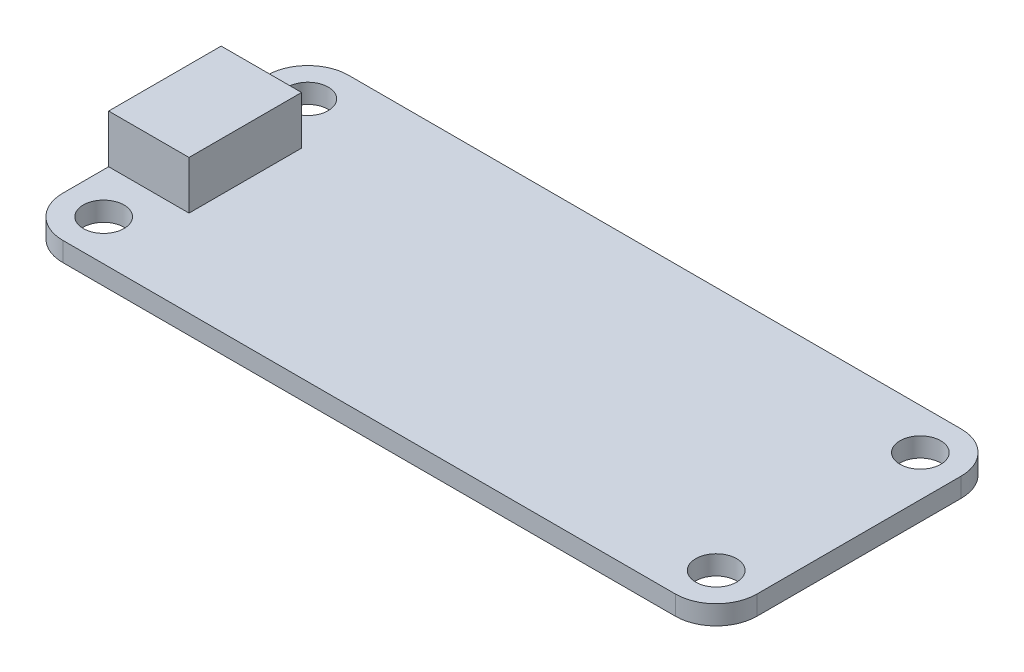
ISO-10303-21;
HEADER;
FILE_DESCRIPTION(('STEP AP214'),'2;1');
FILE_NAME('part.step','',(''),(''),'','','');
FILE_SCHEMA(('AUTOMOTIVE_DESIGN { 1 0 10303 214 1 1 1 1 }'));
ENDSEC;
DATA;
#1=APPLICATION_CONTEXT('core data for automotive mechanical design processes');
#2=APPLICATION_PROTOCOL_DEFINITION('international standard','automotive_design',2000,#1);
#3=PRODUCT_CONTEXT('',#1,'mechanical');
#4=PRODUCT('Part','Part','',(#3));
#5=PRODUCT_RELATED_PRODUCT_CATEGORY('part','',(#4));
#6=PRODUCT_DEFINITION_FORMATION('','',#4);
#7=PRODUCT_DEFINITION_CONTEXT('part definition',#1,'design');
#8=PRODUCT_DEFINITION('design','',#6,#7);
#9=PRODUCT_DEFINITION_SHAPE('','',#8);
#10=(LENGTH_UNIT() NAMED_UNIT(*) SI_UNIT(.MILLI.,.METRE.));
#11=(NAMED_UNIT(*) PLANE_ANGLE_UNIT() SI_UNIT($,.RADIAN.));
#12=(NAMED_UNIT(*) SI_UNIT($,.STERADIAN.) SOLID_ANGLE_UNIT());
#13=UNCERTAINTY_MEASURE_WITH_UNIT(LENGTH_MEASURE(1.E-05),#10,'distance_accuracy_value','');
#14=(GEOMETRIC_REPRESENTATION_CONTEXT(3) GLOBAL_UNCERTAINTY_ASSIGNED_CONTEXT((#13)) GLOBAL_UNIT_ASSIGNED_CONTEXT((#10,
#11,#12)) REPRESENTATION_CONTEXT('',''));
#15=CARTESIAN_POINT('',(0.,0.,0.));
#16=DIRECTION('',(0.,0.,1.));
#17=DIRECTION('',(1.,0.,0.));
#18=AXIS2_PLACEMENT_3D('',#15,#16,#17);
#19=CARTESIAN_POINT('',(0.,1.2,0.));
#20=DIRECTION('',(0.,1.,0.));
#21=DIRECTION('',(0.,0.,1.));
#22=AXIS2_PLACEMENT_3D('',#19,#20,#21);
#23=PLANE('',#22);
#24=DIRECTION('',(-1.,0.,0.));
#25=VECTOR('',#24,1.);
#26=CARTESIAN_POINT('',(-43.18,1.2,-12.39));
#27=LINE('',#26,#25);
#28=CARTESIAN_POINT('',(-38.18,1.2,-12.39));
#29=VERTEX_POINT('',#28);
#30=CARTESIAN_POINT('',(-43.18,1.2,-12.39));
#31=VERTEX_POINT('',#30);
#32=EDGE_CURVE('E57',#29,#31,#27,.T.);
#33=ORIENTED_EDGE('',*,*,#32,.F.);
#34=DIRECTION('',(0.,0.,-1.));
#35=VECTOR('',#34,1.);
#36=CARTESIAN_POINT('',(-38.18,1.2,-5.39));
#37=LINE('',#36,#35);
#38=CARTESIAN_POINT('',(-38.18,1.2,-5.39));
#39=VERTEX_POINT('',#38);
#40=EDGE_CURVE('E313',#39,#29,#37,.T.);
#41=ORIENTED_EDGE('',*,*,#40,.F.);
#42=DIRECTION('',(1.,0.,0.));
#43=VECTOR('',#42,1.);
#44=CARTESIAN_POINT('',(-43.18,1.2,-5.39));
#45=LINE('',#44,#43);
#46=CARTESIAN_POINT('',(-43.18,1.2,-5.39));
#47=VERTEX_POINT('',#46);
#48=EDGE_CURVE('E63',#47,#39,#45,.T.);
#49=ORIENTED_EDGE('',*,*,#48,.F.);
#50=DIRECTION('',(0.,0.,1.));
#51=VECTOR('',#50,1.);
#52=CARTESIAN_POINT('',(-43.18,1.2,0.));
#53=LINE('',#52,#51);
#54=CARTESIAN_POINT('',(-43.18,1.2,-2.54));
#55=VERTEX_POINT('',#54);
#56=EDGE_CURVE('E154',#47,#55,#53,.T.);
#57=ORIENTED_EDGE('',*,*,#56,.T.);
#58=CARTESIAN_POINT('',(-40.64,1.2,-2.54));
#59=DIRECTION('',(0.,1.,0.));
#60=DIRECTION('',(0.,0.,1.));
#61=AXIS2_PLACEMENT_3D('',#58,#59,#60);
#62=CIRCLE('',#61,2.54);
#63=CARTESIAN_POINT('',(-40.64,1.2,0.));
#64=VERTEX_POINT('',#63);
#65=EDGE_CURVE('E251',#55,#64,#62,.T.);
#66=ORIENTED_EDGE('',*,*,#65,.T.);
#67=DIRECTION('',(1.,0.,0.));
#68=VECTOR('',#67,1.);
#69=CARTESIAN_POINT('',(0.,1.2,0.));
#70=LINE('',#69,#68);
#71=CARTESIAN_POINT('',(-2.54,1.2,0.));
#72=VERTEX_POINT('',#71);
#73=EDGE_CURVE('E207',#64,#72,#70,.T.);
#74=ORIENTED_EDGE('',*,*,#73,.T.);
#75=CARTESIAN_POINT('',(-2.54,1.2,-2.54));
#76=DIRECTION('',(0.,1.,0.));
#77=DIRECTION('',(0.,0.,1.));
#78=AXIS2_PLACEMENT_3D('',#75,#76,#77);
#79=CIRCLE('',#78,2.54);
#80=CARTESIAN_POINT('',(0.,1.2,-2.54));
#81=VERTEX_POINT('',#80);
#82=EDGE_CURVE('E254',#72,#81,#79,.T.);
#83=ORIENTED_EDGE('',*,*,#82,.T.);
#84=DIRECTION('',(0.,0.,-1.));
#85=VECTOR('',#84,1.);
#86=CARTESIAN_POINT('',(0.,1.2,0.));
#87=LINE('',#86,#85);
#88=CARTESIAN_POINT('',(0.,1.2,-15.24));
#89=VERTEX_POINT('',#88);
#90=EDGE_CURVE('E195',#81,#89,#87,.T.);
#91=ORIENTED_EDGE('',*,*,#90,.T.);
#92=CARTESIAN_POINT('',(-2.54,1.2,-15.24));
#93=DIRECTION('',(0.,1.,0.));
#94=DIRECTION('',(0.,0.,1.));
#95=AXIS2_PLACEMENT_3D('',#92,#93,#94);
#96=CIRCLE('',#95,2.54);
#97=CARTESIAN_POINT('',(-2.54,1.2,-17.78));
#98=VERTEX_POINT('',#97);
#99=EDGE_CURVE('E257',#89,#98,#96,.T.);
#100=ORIENTED_EDGE('',*,*,#99,.T.);
#101=DIRECTION('',(-1.,0.,0.));
#102=VECTOR('',#101,1.);
#103=CARTESIAN_POINT('',(0.,1.2,-17.78));
#104=LINE('',#103,#102);
#105=CARTESIAN_POINT('',(-40.64,1.2,-17.78));
#106=VERTEX_POINT('',#105);
#107=EDGE_CURVE('E199',#98,#106,#104,.T.);
#108=ORIENTED_EDGE('',*,*,#107,.T.);
#109=CARTESIAN_POINT('',(-40.64,1.2,-15.24));
#110=DIRECTION('',(0.,1.,0.));
#111=DIRECTION('',(0.,0.,1.));
#112=AXIS2_PLACEMENT_3D('',#109,#110,#111);
#113=CIRCLE('',#112,2.54);
#114=CARTESIAN_POINT('',(-43.18,1.2,-15.24));
#115=VERTEX_POINT('',#114);
#116=EDGE_CURVE('E260',#106,#115,#113,.T.);
#117=ORIENTED_EDGE('',*,*,#116,.T.);
#118=EDGE_CURVE('E204',#115,#31,#53,.T.);
#119=ORIENTED_EDGE('',*,*,#118,.T.);
#120=EDGE_LOOP('',(#33,#41,#49,#57,#66,#74,#83,#91,#100,#108,#117,#119));
#121=FACE_BOUND('',#120,.T.);
#122=CARTESIAN_POINT('',(-2.54,1.2,-2.53999999999999));
#123=DIRECTION('',(0.,1.,0.));
#124=DIRECTION('',(0.,0.,1.));
#125=AXIS2_PLACEMENT_3D('',#122,#123,#124);
#126=CIRCLE('',#125,1.27);
#127=CARTESIAN_POINT('',(-2.54,1.2,-1.26999999999999));
#128=VERTEX_POINT('',#127);
#129=EDGE_CURVE('E171',#128,#128,#126,.T.);
#130=ORIENTED_EDGE('',*,*,#129,.F.);
#131=EDGE_LOOP('',(#130));
#132=FACE_BOUND('',#131,.T.);
#133=CARTESIAN_POINT('',(-40.64,1.2,-15.24));
#134=DIRECTION('',(0.,1.,0.));
#135=DIRECTION('',(0.,0.,1.));
#136=AXIS2_PLACEMENT_3D('',#133,#134,#135);
#137=CIRCLE('',#136,1.27);
#138=CARTESIAN_POINT('',(-40.64,1.2,-13.97));
#139=VERTEX_POINT('',#138);
#140=EDGE_CURVE('E187',#139,#139,#137,.T.);
#141=ORIENTED_EDGE('',*,*,#140,.F.);
#142=EDGE_LOOP('',(#141));
#143=FACE_BOUND('',#142,.T.);
#144=CARTESIAN_POINT('',(-40.64,1.2,-2.53999999999999));
#145=DIRECTION('',(0.,1.,0.));
#146=DIRECTION('',(0.,0.,1.));
#147=AXIS2_PLACEMENT_3D('',#144,#145,#146);
#148=CIRCLE('',#147,1.27);
#149=CARTESIAN_POINT('',(-40.64,1.2,-1.26999999999999));
#150=VERTEX_POINT('',#149);
#151=EDGE_CURVE('E179',#150,#150,#148,.T.);
#152=ORIENTED_EDGE('',*,*,#151,.F.);
#153=EDGE_LOOP('',(#152));
#154=FACE_BOUND('',#153,.T.);
#155=CARTESIAN_POINT('',(-2.54,1.2,-15.24));
#156=DIRECTION('',(0.,1.,0.));
#157=DIRECTION('',(0.,0.,1.));
#158=AXIS2_PLACEMENT_3D('',#155,#156,#157);
#159=CIRCLE('',#158,1.27);
#160=CARTESIAN_POINT('',(-2.54,1.2,-13.97));
#161=VERTEX_POINT('',#160);
#162=EDGE_CURVE('E161',#161,#161,#159,.T.);
#163=ORIENTED_EDGE('',*,*,#162,.F.);
#164=EDGE_LOOP('',(#163));
#165=FACE_BOUND('',#164,.T.);
#166=ADVANCED_FACE('F41',(#121,#132,#143,#154,#165),#23,.T.);
#167=CARTESIAN_POINT('',(0.,0.,0.));
#168=DIRECTION('',(0.,1.,0.));
#169=DIRECTION('',(0.,0.,1.));
#170=AXIS2_PLACEMENT_3D('',#167,#168,#169);
#171=PLANE('',#170);
#172=DIRECTION('',(0.,0.,1.));
#173=VECTOR('',#172,1.);
#174=CARTESIAN_POINT('',(-43.18,0.,0.));
#175=LINE('',#174,#173);
#176=CARTESIAN_POINT('',(-43.18,0.,-15.24));
#177=VERTEX_POINT('',#176);
#178=CARTESIAN_POINT('',(-43.18,0.,-2.54));
#179=VERTEX_POINT('',#178);
#180=EDGE_CURVE('E219',#177,#179,#175,.T.);
#181=ORIENTED_EDGE('',*,*,#180,.F.);
#182=CARTESIAN_POINT('',(-40.64,0.,-15.24));
#183=DIRECTION('',(0.,1.,0.));
#184=DIRECTION('',(0.,0.,1.));
#185=AXIS2_PLACEMENT_3D('',#182,#183,#184);
#186=CIRCLE('',#185,2.54);
#187=CARTESIAN_POINT('',(-40.64,0.,-17.78));
#188=VERTEX_POINT('',#187);
#189=EDGE_CURVE('E241',#177,#188,#186,.F.);
#190=ORIENTED_EDGE('',*,*,#189,.T.);
#191=DIRECTION('',(-1.,0.,0.));
#192=VECTOR('',#191,1.);
#193=CARTESIAN_POINT('',(0.,0.,-17.78));
#194=LINE('',#193,#192);
#195=CARTESIAN_POINT('',(-2.54,0.,-17.78));
#196=VERTEX_POINT('',#195);
#197=EDGE_CURVE('E215',#196,#188,#194,.T.);
#198=ORIENTED_EDGE('',*,*,#197,.F.);
#199=CARTESIAN_POINT('',(-2.54,0.,-15.24));
#200=DIRECTION('',(0.,1.,0.));
#201=DIRECTION('',(0.,0.,1.));
#202=AXIS2_PLACEMENT_3D('',#199,#200,#201);
#203=CIRCLE('',#202,2.54);
#204=CARTESIAN_POINT('',(0.,0.,-15.24));
#205=VERTEX_POINT('',#204);
#206=EDGE_CURVE('E238',#196,#205,#203,.F.);
#207=ORIENTED_EDGE('',*,*,#206,.T.);
#208=DIRECTION('',(0.,0.,-1.));
#209=VECTOR('',#208,1.);
#210=CARTESIAN_POINT('',(0.,0.,0.));
#211=LINE('',#210,#209);
#212=CARTESIAN_POINT('',(0.,0.,-2.54));
#213=VERTEX_POINT('',#212);
#214=EDGE_CURVE('E191',#213,#205,#211,.T.);
#215=ORIENTED_EDGE('',*,*,#214,.F.);
#216=CARTESIAN_POINT('',(-2.54,0.,-2.54));
#217=DIRECTION('',(0.,1.,0.));
#218=DIRECTION('',(0.,0.,1.));
#219=AXIS2_PLACEMENT_3D('',#216,#217,#218);
#220=CIRCLE('',#219,2.54);
#221=CARTESIAN_POINT('',(-2.54,0.,0.));
#222=VERTEX_POINT('',#221);
#223=EDGE_CURVE('E235',#213,#222,#220,.F.);
#224=ORIENTED_EDGE('',*,*,#223,.T.);
#225=DIRECTION('',(1.,0.,0.));
#226=VECTOR('',#225,1.);
#227=CARTESIAN_POINT('',(0.,0.,0.));
#228=LINE('',#227,#226);
#229=CARTESIAN_POINT('',(-40.64,0.,0.));
#230=VERTEX_POINT('',#229);
#231=EDGE_CURVE('E200',#230,#222,#228,.T.);
#232=ORIENTED_EDGE('',*,*,#231,.F.);
#233=CARTESIAN_POINT('',(-40.64,0.,-2.54));
#234=DIRECTION('',(0.,1.,0.));
#235=DIRECTION('',(0.,0.,1.));
#236=AXIS2_PLACEMENT_3D('',#233,#234,#235);
#237=CIRCLE('',#236,2.54);
#238=EDGE_CURVE('E232',#230,#179,#237,.F.);
#239=ORIENTED_EDGE('',*,*,#238,.T.);
#240=EDGE_LOOP('',(#181,#190,#198,#207,#215,#224,#232,#239));
#241=FACE_BOUND('',#240,.T.);
#242=CARTESIAN_POINT('',(-40.64,0.,-15.24));
#243=DIRECTION('',(0.,1.,0.));
#244=DIRECTION('',(0.,0.,1.));
#245=AXIS2_PLACEMENT_3D('',#242,#243,#244);
#246=CIRCLE('',#245,1.27);
#247=CARTESIAN_POINT('',(-40.64,0.,-13.97));
#248=VERTEX_POINT('',#247);
#249=EDGE_CURVE('E183',#248,#248,#246,.T.);
#250=ORIENTED_EDGE('',*,*,#249,.T.);
#251=EDGE_LOOP('',(#250));
#252=FACE_BOUND('',#251,.T.);
#253=CARTESIAN_POINT('',(-40.64,0.,-2.53999999999999));
#254=DIRECTION('',(0.,1.,0.));
#255=DIRECTION('',(0.,0.,1.));
#256=AXIS2_PLACEMENT_3D('',#253,#254,#255);
#257=CIRCLE('',#256,1.27);
#258=CARTESIAN_POINT('',(-40.64,0.,-1.26999999999999));
#259=VERTEX_POINT('',#258);
#260=EDGE_CURVE('E175',#259,#259,#257,.T.);
#261=ORIENTED_EDGE('',*,*,#260,.T.);
#262=EDGE_LOOP('',(#261));
#263=FACE_BOUND('',#262,.T.);
#264=CARTESIAN_POINT('',(-2.54,0.,-2.53999999999999));
#265=DIRECTION('',(0.,1.,0.));
#266=DIRECTION('',(0.,0.,1.));
#267=AXIS2_PLACEMENT_3D('',#264,#265,#266);
#268=CIRCLE('',#267,1.27);
#269=CARTESIAN_POINT('',(-2.54,0.,-1.26999999999999));
#270=VERTEX_POINT('',#269);
#271=EDGE_CURVE('E169',#270,#270,#268,.T.);
#272=ORIENTED_EDGE('',*,*,#271,.T.);
#273=EDGE_LOOP('',(#272));
#274=FACE_BOUND('',#273,.T.);
#275=CARTESIAN_POINT('',(-2.54,0.,-15.24));
#276=DIRECTION('',(0.,1.,0.));
#277=DIRECTION('',(0.,0.,1.));
#278=AXIS2_PLACEMENT_3D('',#275,#276,#277);
#279=CIRCLE('',#278,1.27);
#280=CARTESIAN_POINT('',(-2.54,0.,-13.97));
#281=VERTEX_POINT('',#280);
#282=EDGE_CURVE('E156',#281,#281,#279,.T.);
#283=ORIENTED_EDGE('',*,*,#282,.T.);
#284=EDGE_LOOP('',(#283));
#285=FACE_BOUND('',#284,.T.);
#286=ADVANCED_FACE('F281',(#241,#252,#263,#274,#285),#171,.F.);
#287=CARTESIAN_POINT('',(0.,1.2,0.));
#288=DIRECTION('',(-1.,0.,0.));
#289=DIRECTION('',(0.,0.,1.));
#290=AXIS2_PLACEMENT_3D('',#287,#288,#289);
#291=PLANE('',#290);
#292=ORIENTED_EDGE('',*,*,#214,.T.);
#293=DIRECTION('',(0.,-1.,0.));
#294=VECTOR('',#293,1.);
#295=CARTESIAN_POINT('',(0.,1.2,-15.24));
#296=LINE('',#295,#294);
#297=EDGE_CURVE('E267',#205,#89,#296,.F.);
#298=ORIENTED_EDGE('',*,*,#297,.T.);
#299=ORIENTED_EDGE('',*,*,#90,.F.);
#300=DIRECTION('',(0.,-1.,0.));
#301=VECTOR('',#300,1.);
#302=CARTESIAN_POINT('',(0.,1.2,-2.54));
#303=LINE('',#302,#301);
#304=EDGE_CURVE('E263',#81,#213,#303,.T.);
#305=ORIENTED_EDGE('',*,*,#304,.T.);
#306=EDGE_LOOP('',(#292,#298,#299,#305));
#307=FACE_BOUND('',#306,.T.);
#308=ADVANCED_FACE('F290',(#307),#291,.F.);
#309=CARTESIAN_POINT('',(0.,1.2,-17.78));
#310=DIRECTION('',(0.,0.,1.));
#311=DIRECTION('',(1.,0.,0.));
#312=AXIS2_PLACEMENT_3D('',#309,#310,#311);
#313=PLANE('',#312);
#314=ORIENTED_EDGE('',*,*,#197,.T.);
#315=DIRECTION('',(0.,-1.,0.));
#316=VECTOR('',#315,1.);
#317=CARTESIAN_POINT('',(-40.64,1.2,-17.78));
#318=LINE('',#317,#316);
#319=EDGE_CURVE('E248',#188,#106,#318,.F.);
#320=ORIENTED_EDGE('',*,*,#319,.T.);
#321=ORIENTED_EDGE('',*,*,#107,.F.);
#322=DIRECTION('',(0.,-1.,0.));
#323=VECTOR('',#322,1.);
#324=CARTESIAN_POINT('',(-2.54,1.2,-17.78));
#325=LINE('',#324,#323);
#326=EDGE_CURVE('E244',#98,#196,#325,.T.);
#327=ORIENTED_EDGE('',*,*,#326,.T.);
#328=EDGE_LOOP('',(#314,#320,#321,#327));
#329=FACE_BOUND('',#328,.T.);
#330=ADVANCED_FACE('F300',(#329),#313,.F.);
#331=CARTESIAN_POINT('',(-43.18,1.2,0.));
#332=DIRECTION('',(1.,0.,0.));
#333=DIRECTION('',(0.,0.,-1.));
#334=AXIS2_PLACEMENT_3D('',#331,#332,#333);
#335=PLANE('',#334);
#336=ORIENTED_EDGE('',*,*,#118,.F.);
#337=DIRECTION('',(0.,-1.,0.));
#338=VECTOR('',#337,1.);
#339=CARTESIAN_POINT('',(-43.18,1.2,-15.24));
#340=LINE('',#339,#338);
#341=EDGE_CURVE('E228',#115,#177,#340,.T.);
#342=ORIENTED_EDGE('',*,*,#341,.T.);
#343=ORIENTED_EDGE('',*,*,#180,.T.);
#344=DIRECTION('',(0.,-1.,0.));
#345=VECTOR('',#344,1.);
#346=CARTESIAN_POINT('',(-43.18,1.2,-2.54));
#347=LINE('',#346,#345);
#348=EDGE_CURVE('E211',#179,#55,#347,.F.);
#349=ORIENTED_EDGE('',*,*,#348,.T.);
#350=ORIENTED_EDGE('',*,*,#56,.F.);
#351=DIRECTION('',(0.,-1.,0.));
#352=VECTOR('',#351,1.);
#353=CARTESIAN_POINT('',(-43.18,4.2,-5.39));
#354=LINE('',#353,#352);
#355=CARTESIAN_POINT('',(-43.18,4.2,-5.39));
#356=VERTEX_POINT('',#355);
#357=EDGE_CURVE('E133',#356,#47,#354,.T.);
#358=ORIENTED_EDGE('',*,*,#357,.F.);
#359=DIRECTION('',(0.,0.,1.));
#360=VECTOR('',#359,1.);
#361=CARTESIAN_POINT('',(-43.18,4.2,-5.39));
#362=LINE('',#361,#360);
#363=CARTESIAN_POINT('',(-43.18,4.2,-12.39));
#364=VERTEX_POINT('',#363);
#365=EDGE_CURVE('E140',#364,#356,#362,.T.);
#366=ORIENTED_EDGE('',*,*,#365,.F.);
#367=DIRECTION('',(0.,-1.,0.));
#368=VECTOR('',#367,1.);
#369=CARTESIAN_POINT('',(-43.18,4.2,-12.39));
#370=LINE('',#369,#368);
#371=EDGE_CURVE('E307',#364,#31,#370,.T.);
#372=ORIENTED_EDGE('',*,*,#371,.T.);
#373=EDGE_LOOP('',(#336,#342,#343,#349,#350,#358,#366,#372));
#374=FACE_BOUND('',#373,.T.);
#375=ADVANCED_FACE('F152',(#374),#335,.F.);
#376=CARTESIAN_POINT('',(0.,1.2,0.));
#377=DIRECTION('',(0.,0.,-1.));
#378=DIRECTION('',(-1.,0.,0.));
#379=AXIS2_PLACEMENT_3D('',#376,#377,#378);
#380=PLANE('',#379);
#381=ORIENTED_EDGE('',*,*,#231,.T.);
#382=DIRECTION('',(0.,-1.,0.));
#383=VECTOR('',#382,1.);
#384=CARTESIAN_POINT('',(-2.54,1.2,0.));
#385=LINE('',#384,#383);
#386=EDGE_CURVE('E11',#222,#72,#385,.F.);
#387=ORIENTED_EDGE('',*,*,#386,.T.);
#388=ORIENTED_EDGE('',*,*,#73,.F.);
#389=DIRECTION('',(0.,-1.,0.));
#390=VECTOR('',#389,1.);
#391=CARTESIAN_POINT('',(-40.64,1.2,0.));
#392=LINE('',#391,#390);
#393=EDGE_CURVE('E50',#64,#230,#392,.T.);
#394=ORIENTED_EDGE('',*,*,#393,.T.);
#395=EDGE_LOOP('',(#381,#387,#388,#394));
#396=FACE_BOUND('',#395,.T.);
#397=ADVANCED_FACE('F275',(#396),#380,.F.);
#398=CARTESIAN_POINT('',(-40.64,1.2,-15.24));
#399=DIRECTION('',(0.,-1.,0.));
#400=DIRECTION('',(0.,0.,-1.));
#401=AXIS2_PLACEMENT_3D('',#398,#399,#400);
#402=CYLINDRICAL_SURFACE('',#401,1.27);
#403=ORIENTED_EDGE('',*,*,#140,.T.);
#404=EDGE_LOOP('',(#403));
#405=FACE_BOUND('',#404,.T.);
#406=ORIENTED_EDGE('',*,*,#249,.F.);
#407=EDGE_LOOP('',(#406));
#408=FACE_BOUND('',#407,.T.);
#409=ADVANCED_FACE('F343',(#405,#408),#402,.F.);
#410=CARTESIAN_POINT('',(-40.64,1.2,-2.53999999999999));
#411=DIRECTION('',(0.,-1.,0.));
#412=DIRECTION('',(0.,0.,-1.));
#413=AXIS2_PLACEMENT_3D('',#410,#411,#412);
#414=CYLINDRICAL_SURFACE('',#413,1.27);
#415=ORIENTED_EDGE('',*,*,#151,.T.);
#416=EDGE_LOOP('',(#415));
#417=FACE_BOUND('',#416,.T.);
#418=ORIENTED_EDGE('',*,*,#260,.F.);
#419=EDGE_LOOP('',(#418));
#420=FACE_BOUND('',#419,.T.);
#421=ADVANCED_FACE('F434',(#417,#420),#414,.F.);
#422=CARTESIAN_POINT('',(-2.54,1.2,-2.53999999999999));
#423=DIRECTION('',(0.,-1.,0.));
#424=DIRECTION('',(0.,0.,-1.));
#425=AXIS2_PLACEMENT_3D('',#422,#423,#424);
#426=CYLINDRICAL_SURFACE('',#425,1.27);
#427=ORIENTED_EDGE('',*,*,#129,.T.);
#428=EDGE_LOOP('',(#427));
#429=FACE_BOUND('',#428,.T.);
#430=ORIENTED_EDGE('',*,*,#271,.F.);
#431=EDGE_LOOP('',(#430));
#432=FACE_BOUND('',#431,.T.);
#433=ADVANCED_FACE('F442',(#429,#432),#426,.F.);
#434=CARTESIAN_POINT('',(-2.54,1.2,-15.24));
#435=DIRECTION('',(0.,-1.,0.));
#436=DIRECTION('',(0.,0.,-1.));
#437=AXIS2_PLACEMENT_3D('',#434,#435,#436);
#438=CYLINDRICAL_SURFACE('',#437,1.27);
#439=ORIENTED_EDGE('',*,*,#162,.T.);
#440=EDGE_LOOP('',(#439));
#441=FACE_BOUND('',#440,.T.);
#442=ORIENTED_EDGE('',*,*,#282,.F.);
#443=EDGE_LOOP('',(#442));
#444=FACE_BOUND('',#443,.T.);
#445=ADVANCED_FACE('F356',(#441,#444),#438,.F.);
#446=CARTESIAN_POINT('',(-40.64,1.2,-15.24));
#447=DIRECTION('',(0.,-1.,0.));
#448=DIRECTION('',(0.,0.,-1.));
#449=AXIS2_PLACEMENT_3D('',#446,#447,#448);
#450=CYLINDRICAL_SURFACE('',#449,2.54);
#451=ORIENTED_EDGE('',*,*,#116,.F.);
#452=ORIENTED_EDGE('',*,*,#319,.F.);
#453=ORIENTED_EDGE('',*,*,#189,.F.);
#454=ORIENTED_EDGE('',*,*,#341,.F.);
#455=EDGE_LOOP('',(#451,#452,#453,#454));
#456=FACE_BOUND('',#455,.T.);
#457=ADVANCED_FACE('F305',(#456),#450,.T.);
#458=CARTESIAN_POINT('',(-2.54,1.2,-15.24));
#459=DIRECTION('',(0.,-1.,0.));
#460=DIRECTION('',(0.,0.,-1.));
#461=AXIS2_PLACEMENT_3D('',#458,#459,#460);
#462=CYLINDRICAL_SURFACE('',#461,2.54);
#463=ORIENTED_EDGE('',*,*,#99,.F.);
#464=ORIENTED_EDGE('',*,*,#297,.F.);
#465=ORIENTED_EDGE('',*,*,#206,.F.);
#466=ORIENTED_EDGE('',*,*,#326,.F.);
#467=EDGE_LOOP('',(#463,#464,#465,#466));
#468=FACE_BOUND('',#467,.T.);
#469=ADVANCED_FACE('F297',(#468),#462,.T.);
#470=CARTESIAN_POINT('',(-2.54,1.2,-2.54));
#471=DIRECTION('',(0.,-1.,0.));
#472=DIRECTION('',(0.,0.,-1.));
#473=AXIS2_PLACEMENT_3D('',#470,#471,#472);
#474=CYLINDRICAL_SURFACE('',#473,2.54);
#475=ORIENTED_EDGE('',*,*,#82,.F.);
#476=ORIENTED_EDGE('',*,*,#386,.F.);
#477=ORIENTED_EDGE('',*,*,#223,.F.);
#478=ORIENTED_EDGE('',*,*,#304,.F.);
#479=EDGE_LOOP('',(#475,#476,#477,#478));
#480=FACE_BOUND('',#479,.T.);
#481=ADVANCED_FACE('F287',(#480),#474,.T.);
#482=CARTESIAN_POINT('',(-40.64,1.2,-2.54));
#483=DIRECTION('',(0.,-1.,0.));
#484=DIRECTION('',(0.,0.,-1.));
#485=AXIS2_PLACEMENT_3D('',#482,#483,#484);
#486=CYLINDRICAL_SURFACE('',#485,2.54);
#487=ORIENTED_EDGE('',*,*,#65,.F.);
#488=ORIENTED_EDGE('',*,*,#348,.F.);
#489=ORIENTED_EDGE('',*,*,#238,.F.);
#490=ORIENTED_EDGE('',*,*,#393,.F.);
#491=EDGE_LOOP('',(#487,#488,#489,#490));
#492=FACE_BOUND('',#491,.T.);
#493=ADVANCED_FACE('F43',(#492),#486,.T.);
#494=CARTESIAN_POINT('',(-43.18,4.2,-5.39));
#495=DIRECTION('',(0.,0.,-1.));
#496=DIRECTION('',(-1.,0.,0.));
#497=AXIS2_PLACEMENT_3D('',#494,#495,#496);
#498=PLANE('',#497);
#499=ORIENTED_EDGE('',*,*,#48,.T.);
#500=DIRECTION('',(0.,-1.,0.));
#501=VECTOR('',#500,1.);
#502=CARTESIAN_POINT('',(-38.18,4.2,-5.39));
#503=LINE('',#502,#501);
#504=CARTESIAN_POINT('',(-38.18,4.2,-5.39));
#505=VERTEX_POINT('',#504);
#506=EDGE_CURVE('E135',#505,#39,#503,.T.);
#507=ORIENTED_EDGE('',*,*,#506,.F.);
#508=DIRECTION('',(1.,0.,0.));
#509=VECTOR('',#508,1.);
#510=CARTESIAN_POINT('',(-43.18,4.2,-5.39));
#511=LINE('',#510,#509);
#512=EDGE_CURVE('E129',#356,#505,#511,.T.);
#513=ORIENTED_EDGE('',*,*,#512,.F.);
#514=ORIENTED_EDGE('',*,*,#357,.T.);
#515=EDGE_LOOP('',(#499,#507,#513,#514));
#516=FACE_BOUND('',#515,.T.);
#517=ADVANCED_FACE('F131',(#516),#498,.F.);
#518=CARTESIAN_POINT('',(-38.18,4.2,-5.39));
#519=DIRECTION('',(-1.,0.,0.));
#520=DIRECTION('',(0.,0.,1.));
#521=AXIS2_PLACEMENT_3D('',#518,#519,#520);
#522=PLANE('',#521);
#523=ORIENTED_EDGE('',*,*,#40,.T.);
#524=DIRECTION('',(0.,-1.,0.));
#525=VECTOR('',#524,1.);
#526=CARTESIAN_POINT('',(-38.18,4.2,-12.39));
#527=LINE('',#526,#525);
#528=CARTESIAN_POINT('',(-38.18,4.2,-12.39));
#529=VERTEX_POINT('',#528);
#530=EDGE_CURVE('E163',#529,#29,#527,.T.);
#531=ORIENTED_EDGE('',*,*,#530,.F.);
#532=DIRECTION('',(0.,0.,-1.));
#533=VECTOR('',#532,1.);
#534=CARTESIAN_POINT('',(-38.18,4.2,-5.39));
#535=LINE('',#534,#533);
#536=EDGE_CURVE('E139',#505,#529,#535,.T.);
#537=ORIENTED_EDGE('',*,*,#536,.F.);
#538=ORIENTED_EDGE('',*,*,#506,.T.);
#539=EDGE_LOOP('',(#523,#531,#537,#538));
#540=FACE_BOUND('',#539,.T.);
#541=ADVANCED_FACE('F327',(#540),#522,.F.);
#542=CARTESIAN_POINT('',(-43.18,4.2,-12.39));
#543=DIRECTION('',(0.,0.,1.));
#544=DIRECTION('',(1.,0.,0.));
#545=AXIS2_PLACEMENT_3D('',#542,#543,#544);
#546=PLANE('',#545);
#547=ORIENTED_EDGE('',*,*,#32,.T.);
#548=ORIENTED_EDGE('',*,*,#371,.F.);
#549=DIRECTION('',(-1.,0.,0.));
#550=VECTOR('',#549,1.);
#551=CARTESIAN_POINT('',(-43.18,4.2,-12.39));
#552=LINE('',#551,#550);
#553=EDGE_CURVE('E145',#529,#364,#552,.T.);
#554=ORIENTED_EDGE('',*,*,#553,.F.);
#555=ORIENTED_EDGE('',*,*,#530,.T.);
#556=EDGE_LOOP('',(#547,#548,#554,#555));
#557=FACE_BOUND('',#556,.T.);
#558=ADVANCED_FACE('F310',(#557),#546,.F.);
#559=CARTESIAN_POINT('',(0.,4.2,0.));
#560=DIRECTION('',(0.,-1.,0.));
#561=DIRECTION('',(0.,0.,-1.));
#562=AXIS2_PLACEMENT_3D('',#559,#560,#561);
#563=PLANE('',#562);
#564=ORIENTED_EDGE('',*,*,#365,.T.);
#565=ORIENTED_EDGE('',*,*,#512,.T.);
#566=ORIENTED_EDGE('',*,*,#536,.T.);
#567=ORIENTED_EDGE('',*,*,#553,.T.);
#568=EDGE_LOOP('',(#564,#565,#566,#567));
#569=FACE_BOUND('',#568,.T.);
#570=ADVANCED_FACE('F143',(#569),#563,.F.);
#571=CLOSED_SHELL('',(#166,#286,#308,#330,#375,#397,#409,#421,#433,#445,#457,#469,#481,#493,
#517,#541,#558,#570));
#572=MANIFOLD_SOLID_BREP('B2',#571);
#573=ADVANCED_BREP_SHAPE_REPRESENTATION('',(#18,#572),#14);
#574=SHAPE_DEFINITION_REPRESENTATION(#9,#573);
ENDSEC;
END-ISO-10303-21;
